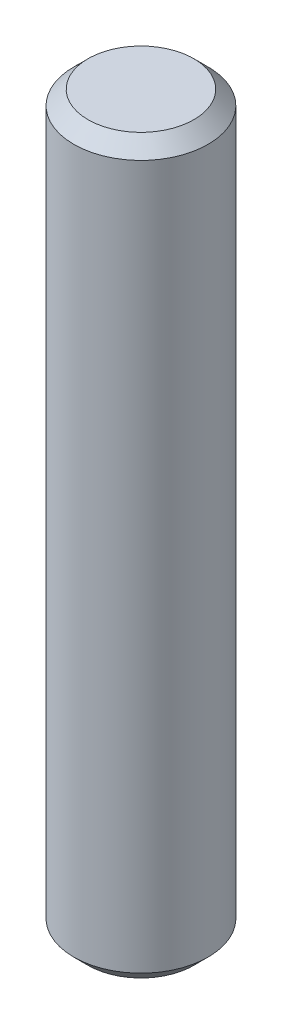
ISO-10303-21;
HEADER;
FILE_DESCRIPTION(('STEP AP214'),'2;1');
FILE_NAME('part.step','',(''),(''),'','','');
FILE_SCHEMA(('AUTOMOTIVE_DESIGN { 1 0 10303 214 1 1 1 1 }'));
ENDSEC;
DATA;
#1=APPLICATION_CONTEXT('core data for automotive mechanical design processes');
#2=APPLICATION_PROTOCOL_DEFINITION('international standard','automotive_design',2000,#1);
#3=PRODUCT_CONTEXT('',#1,'mechanical');
#4=PRODUCT('Part','Part','',(#3));
#5=PRODUCT_RELATED_PRODUCT_CATEGORY('part','',(#4));
#6=PRODUCT_DEFINITION_FORMATION('','',#4);
#7=PRODUCT_DEFINITION_CONTEXT('part definition',#1,'design');
#8=PRODUCT_DEFINITION('design','',#6,#7);
#9=PRODUCT_DEFINITION_SHAPE('','',#8);
#10=(LENGTH_UNIT() NAMED_UNIT(*) SI_UNIT(.MILLI.,.METRE.));
#11=(NAMED_UNIT(*) PLANE_ANGLE_UNIT() SI_UNIT($,.RADIAN.));
#12=(NAMED_UNIT(*) SI_UNIT($,.STERADIAN.) SOLID_ANGLE_UNIT());
#13=UNCERTAINTY_MEASURE_WITH_UNIT(LENGTH_MEASURE(1.E-05),#10,'distance_accuracy_value','');
#14=(GEOMETRIC_REPRESENTATION_CONTEXT(3) GLOBAL_UNCERTAINTY_ASSIGNED_CONTEXT((#13)) GLOBAL_UNIT_ASSIGNED_CONTEXT((#10,
#11,#12)) REPRESENTATION_CONTEXT('',''));
#15=CARTESIAN_POINT('',(0.,0.,0.));
#16=DIRECTION('',(0.,0.,1.));
#17=DIRECTION('',(1.,0.,0.));
#18=AXIS2_PLACEMENT_3D('',#15,#16,#17);
#19=CARTESIAN_POINT('',(0.,18.,0.));
#20=DIRECTION('',(0.,-1.,0.));
#21=DIRECTION('',(0.,0.,-1.));
#22=AXIS2_PLACEMENT_3D('',#19,#20,#21);
#23=CYLINDRICAL_SURFACE('',#22,1.65);
#24=CARTESIAN_POINT('',(0.,0.350000000000003,0.));
#25=DIRECTION('',(0.,1.,0.));
#26=DIRECTION('',(0.,0.,1.));
#27=AXIS2_PLACEMENT_3D('',#24,#25,#26);
#28=CIRCLE('',#27,1.65);
#29=CARTESIAN_POINT('',(0.,0.350000000000003,1.65));
#30=VERTEX_POINT('',#29);
#31=EDGE_CURVE('E52',#30,#30,#28,.T.);
#32=ORIENTED_EDGE('',*,*,#31,.T.);
#33=EDGE_LOOP('',(#32));
#34=FACE_BOUND('',#33,.T.);
#35=CARTESIAN_POINT('',(0.,17.65,0.));
#36=DIRECTION('',(0.,1.,0.));
#37=DIRECTION('',(0.,0.,1.));
#38=AXIS2_PLACEMENT_3D('',#35,#36,#37);
#39=CIRCLE('',#38,1.65);
#40=CARTESIAN_POINT('',(0.,17.65,1.65));
#41=VERTEX_POINT('',#40);
#42=EDGE_CURVE('E56',#41,#41,#39,.F.);
#43=ORIENTED_EDGE('',*,*,#42,.T.);
#44=EDGE_LOOP('',(#43));
#45=FACE_BOUND('',#44,.T.);
#46=ADVANCED_FACE('F40',(#34,#45),#23,.T.);
#47=CARTESIAN_POINT('',(0.,18.,0.));
#48=DIRECTION('',(0.,1.,0.));
#49=DIRECTION('',(0.,0.,1.));
#50=AXIS2_PLACEMENT_3D('',#47,#48,#49);
#51=PLANE('',#50);
#52=CARTESIAN_POINT('',(0.,18.,0.));
#53=DIRECTION('',(0.,1.,0.));
#54=DIRECTION('',(0.,0.,1.));
#55=AXIS2_PLACEMENT_3D('',#52,#53,#54);
#56=CIRCLE('',#55,1.3);
#57=CARTESIAN_POINT('',(0.,18.,1.3));
#58=VERTEX_POINT('',#57);
#59=EDGE_CURVE('E10',#58,#58,#56,.T.);
#60=ORIENTED_EDGE('',*,*,#59,.T.);
#61=EDGE_LOOP('',(#60));
#62=FACE_BOUND('',#61,.T.);
#63=ADVANCED_FACE('F72',(#62),#51,.T.);
#64=CARTESIAN_POINT('',(0.,0.,0.));
#65=DIRECTION('',(0.,1.,0.));
#66=DIRECTION('',(0.,0.,1.));
#67=AXIS2_PLACEMENT_3D('',#64,#65,#66);
#68=PLANE('',#67);
#69=CARTESIAN_POINT('',(0.,0.,0.));
#70=DIRECTION('',(0.,1.,0.));
#71=DIRECTION('',(0.,0.,1.));
#72=AXIS2_PLACEMENT_3D('',#69,#70,#71);
#73=CIRCLE('',#72,1.3);
#74=CARTESIAN_POINT('',(0.,0.,1.3));
#75=VERTEX_POINT('',#74);
#76=EDGE_CURVE('E48',#75,#75,#73,.F.);
#77=ORIENTED_EDGE('',*,*,#76,.T.);
#78=EDGE_LOOP('',(#77));
#79=FACE_BOUND('',#78,.T.);
#80=ADVANCED_FACE('F69',(#79),#68,.F.);
#81=CARTESIAN_POINT('',(0.,0.350000000000003,0.));
#82=DIRECTION('',(0.,1.,0.));
#83=DIRECTION('',(0.,0.,1.));
#84=AXIS2_PLACEMENT_3D('',#81,#82,#83);
#85=CONICAL_SURFACE('',#84,1.65,0.78539816339745);
#86=ORIENTED_EDGE('',*,*,#76,.F.);
#87=EDGE_LOOP('',(#86));
#88=FACE_BOUND('',#87,.T.);
#89=ORIENTED_EDGE('',*,*,#31,.F.);
#90=EDGE_LOOP('',(#89));
#91=FACE_BOUND('',#90,.T.);
#92=ADVANCED_FACE('F65',(#88,#91),#85,.T.);
#93=CARTESIAN_POINT('',(0.,18.,0.));
#94=DIRECTION('',(0.,-1.,0.));
#95=DIRECTION('',(0.,0.,-1.));
#96=AXIS2_PLACEMENT_3D('',#93,#94,#95);
#97=CONICAL_SURFACE('',#96,1.3,0.785398163397448);
#98=ORIENTED_EDGE('',*,*,#42,.F.);
#99=EDGE_LOOP('',(#98));
#100=FACE_BOUND('',#99,.T.);
#101=ORIENTED_EDGE('',*,*,#59,.F.);
#102=EDGE_LOOP('',(#101));
#103=FACE_BOUND('',#102,.T.);
#104=ADVANCED_FACE('F43',(#100,#103),#97,.T.);
#105=CLOSED_SHELL('',(#46,#63,#80,#92,#104));
#106=MANIFOLD_SOLID_BREP('B2',#105);
#107=ADVANCED_BREP_SHAPE_REPRESENTATION('',(#18,#106),#14);
#108=SHAPE_DEFINITION_REPRESENTATION(#9,#107);
ENDSEC;
END-ISO-10303-21;
